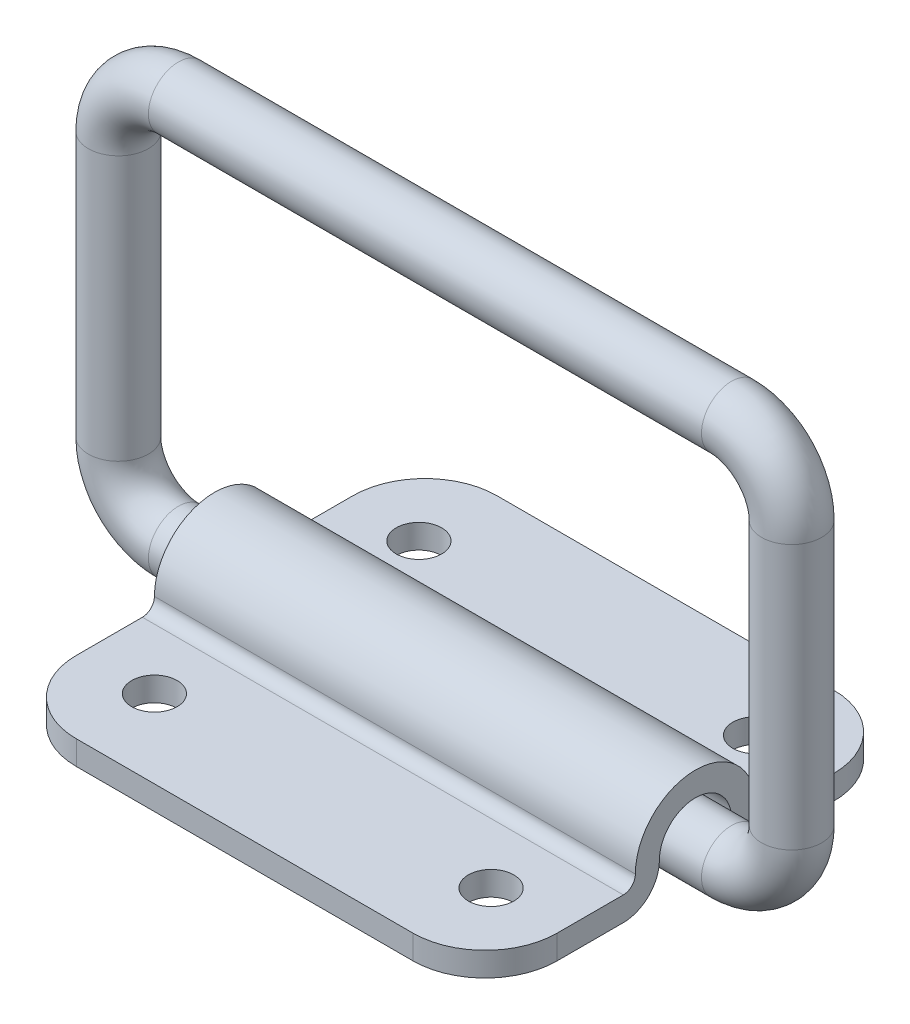
ISO-10303-21;
HEADER;
FILE_DESCRIPTION(('STEP AP214'),'2;1');
FILE_NAME('part.step','',(''),(''),'','','');
FILE_SCHEMA(('AUTOMOTIVE_DESIGN { 1 0 10303 214 1 1 1 1 }'));
ENDSEC;
DATA;
#1=APPLICATION_CONTEXT('core data for automotive mechanical design processes');
#2=APPLICATION_PROTOCOL_DEFINITION('international standard','automotive_design',2000,#1);
#3=PRODUCT_CONTEXT('',#1,'mechanical');
#4=PRODUCT('Part','Part','',(#3));
#5=PRODUCT_RELATED_PRODUCT_CATEGORY('part','',(#4));
#6=PRODUCT_DEFINITION_FORMATION('','',#4);
#7=PRODUCT_DEFINITION_CONTEXT('part definition',#1,'design');
#8=PRODUCT_DEFINITION('design','',#6,#7);
#9=PRODUCT_DEFINITION_SHAPE('','',#8);
#10=(LENGTH_UNIT() NAMED_UNIT(*) SI_UNIT(.MILLI.,.METRE.));
#11=(NAMED_UNIT(*) PLANE_ANGLE_UNIT() SI_UNIT($,.RADIAN.));
#12=(NAMED_UNIT(*) SI_UNIT($,.STERADIAN.) SOLID_ANGLE_UNIT());
#13=UNCERTAINTY_MEASURE_WITH_UNIT(LENGTH_MEASURE(1.E-05),#10,'distance_accuracy_value','');
#14=(GEOMETRIC_REPRESENTATION_CONTEXT(3) GLOBAL_UNCERTAINTY_ASSIGNED_CONTEXT((#13)) GLOBAL_UNIT_ASSIGNED_CONTEXT((#10,
#11,#12)) REPRESENTATION_CONTEXT('',''));
#15=CARTESIAN_POINT('',(0.,0.,0.));
#16=DIRECTION('',(0.,0.,1.));
#17=DIRECTION('',(1.,0.,0.));
#18=AXIS2_PLACEMENT_3D('',#15,#16,#17);
#19=CARTESIAN_POINT('',(-31.75,0.,9.525));
#20=DIRECTION('',(1.,0.,0.));
#21=DIRECTION('',(0.,0.,-1.));
#22=AXIS2_PLACEMENT_3D('',#19,#20,#21);
#23=PLANE('',#22);
#24=DIRECTION('',(0.,-1.,0.));
#25=VECTOR('',#24,1.);
#26=CARTESIAN_POINT('',(-31.75,54.7687500000001,-18.25625));
#27=LINE('',#26,#25);
#28=CARTESIAN_POINT('',(-31.75,-4.7625,-18.25625));
#29=VERTEX_POINT('',#28);
#30=CARTESIAN_POINT('',(-31.75,-1.5875,-18.25625));
#31=VERTEX_POINT('',#30);
#32=EDGE_CURVE('E12',#29,#31,#27,.F.);
#33=ORIENTED_EDGE('',*,*,#32,.F.);
#34=DIRECTION('',(0.,0.,-1.));
#35=VECTOR('',#34,1.);
#36=CARTESIAN_POINT('',(-31.75,-4.7625,-27.78125));
#37=LINE('',#36,#35);
#38=CARTESIAN_POINT('',(-31.75,-4.7625,-9.525));
#39=VERTEX_POINT('',#38);
#40=EDGE_CURVE('E171',#39,#29,#37,.T.);
#41=ORIENTED_EDGE('',*,*,#40,.F.);
#42=CARTESIAN_POINT('',(-31.75,0.,-9.525));
#43=DIRECTION('',(1.,0.,0.));
#44=DIRECTION('',(0.,0.,1.));
#45=AXIS2_PLACEMENT_3D('',#42,#43,#44);
#46=CIRCLE('',#45,4.7625);
#47=CARTESIAN_POINT('',(-31.75,0.,-4.7625));
#48=VERTEX_POINT('',#47);
#49=EDGE_CURVE('E277',#48,#39,#46,.T.);
#50=ORIENTED_EDGE('',*,*,#49,.F.);
#51=CARTESIAN_POINT('',(-31.75,0.,0.));
#52=DIRECTION('',(-1.,0.,0.));
#53=DIRECTION('',(0.,0.,1.));
#54=AXIS2_PLACEMENT_3D('',#51,#52,#53);
#55=CIRCLE('',#54,4.7625);
#56=CARTESIAN_POINT('',(-31.75,0.,4.7625));
#57=VERTEX_POINT('',#56);
#58=EDGE_CURVE('E275',#57,#48,#55,.T.);
#59=ORIENTED_EDGE('',*,*,#58,.F.);
#60=CARTESIAN_POINT('',(-31.75,0.,9.525));
#61=DIRECTION('',(1.,0.,0.));
#62=DIRECTION('',(0.,0.,-1.));
#63=AXIS2_PLACEMENT_3D('',#60,#61,#62);
#64=CIRCLE('',#63,4.7625);
#65=CARTESIAN_POINT('',(-31.75,-4.7625,9.525));
#66=VERTEX_POINT('',#65);
#67=EDGE_CURVE('E273',#66,#57,#64,.T.);
#68=ORIENTED_EDGE('',*,*,#67,.F.);
#69=DIRECTION('',(0.,0.,-1.));
#70=VECTOR('',#69,1.);
#71=CARTESIAN_POINT('',(-31.75,-4.7625,27.78125));
#72=LINE('',#71,#70);
#73=CARTESIAN_POINT('',(-31.75,-4.7625,18.25625));
#74=VERTEX_POINT('',#73);
#75=EDGE_CURVE('E247',#74,#66,#72,.T.);
#76=ORIENTED_EDGE('',*,*,#75,.F.);
#77=DIRECTION('',(0.,-1.,0.));
#78=VECTOR('',#77,1.);
#79=CARTESIAN_POINT('',(-31.75,54.7687500000001,18.25625));
#80=LINE('',#79,#78);
#81=CARTESIAN_POINT('',(-31.75,-1.5875,18.25625));
#82=VERTEX_POINT('',#81);
#83=EDGE_CURVE('E193',#74,#82,#80,.F.);
#84=ORIENTED_EDGE('',*,*,#83,.T.);
#85=DIRECTION('',(0.,0.,1.));
#86=VECTOR('',#85,1.);
#87=CARTESIAN_POINT('',(-31.75,-1.5875,27.78125));
#88=LINE('',#87,#86);
#89=CARTESIAN_POINT('',(-31.75,-1.5875,9.525));
#90=VERTEX_POINT('',#89);
#91=EDGE_CURVE('E251',#90,#82,#88,.T.);
#92=ORIENTED_EDGE('',*,*,#91,.F.);
#93=CARTESIAN_POINT('',(-31.75,0.,9.525));
#94=DIRECTION('',(-1.,0.,0.));
#95=DIRECTION('',(0.,0.,-1.));
#96=AXIS2_PLACEMENT_3D('',#93,#94,#95);
#97=CIRCLE('',#96,1.5875);
#98=CARTESIAN_POINT('',(-31.75,0.,7.9375));
#99=VERTEX_POINT('',#98);
#100=EDGE_CURVE('E286',#99,#90,#97,.T.);
#101=ORIENTED_EDGE('',*,*,#100,.F.);
#102=CARTESIAN_POINT('',(-31.75,0.,0.));
#103=DIRECTION('',(1.,0.,0.));
#104=DIRECTION('',(0.,0.,1.));
#105=AXIS2_PLACEMENT_3D('',#102,#103,#104);
#106=CIRCLE('',#105,7.9375);
#107=CARTESIAN_POINT('',(-31.75,0.,-7.9375));
#108=VERTEX_POINT('',#107);
#109=EDGE_CURVE('E284',#108,#99,#106,.T.);
#110=ORIENTED_EDGE('',*,*,#109,.F.);
#111=CARTESIAN_POINT('',(-31.75,0.,-9.525));
#112=DIRECTION('',(-1.,0.,0.));
#113=DIRECTION('',(0.,0.,1.));
#114=AXIS2_PLACEMENT_3D('',#111,#112,#113);
#115=CIRCLE('',#114,1.5875);
#116=CARTESIAN_POINT('',(-31.75,-1.5875,-9.525));
#117=VERTEX_POINT('',#116);
#118=EDGE_CURVE('E282',#117,#108,#115,.T.);
#119=ORIENTED_EDGE('',*,*,#118,.F.);
#120=DIRECTION('',(0.,0.,1.));
#121=VECTOR('',#120,1.);
#122=CARTESIAN_POINT('',(-31.75,-1.5875,-27.78125));
#123=LINE('',#122,#121);
#124=EDGE_CURVE('E280',#31,#117,#123,.T.);
#125=ORIENTED_EDGE('',*,*,#124,.F.);
#126=EDGE_LOOP('',(#33,#41,#50,#59,#68,#76,#84,#92,#101,#110,#119,#125));
#127=FACE_BOUND('',#126,.T.);
#128=ADVANCED_FACE('F44',(#127),#23,.F.);
#129=CARTESIAN_POINT('',(31.75,-4.7625,-27.78125));
#130=DIRECTION('',(0.,0.,1.));
#131=DIRECTION('',(1.,0.,0.));
#132=AXIS2_PLACEMENT_3D('',#129,#130,#131);
#133=PLANE('',#132);
#134=DIRECTION('',(-1.,0.,0.));
#135=VECTOR('',#134,1.);
#136=CARTESIAN_POINT('',(31.75,-4.7625,-27.78125));
#137=LINE('',#136,#135);
#138=CARTESIAN_POINT('',(22.225,-4.7625,-27.78125));
#139=VERTEX_POINT('',#138);
#140=CARTESIAN_POINT('',(-22.225,-4.7625,-27.78125));
#141=VERTEX_POINT('',#140);
#142=EDGE_CURVE('E168',#139,#141,#137,.T.);
#143=ORIENTED_EDGE('',*,*,#142,.T.);
#144=DIRECTION('',(0.,-1.,0.));
#145=VECTOR('',#144,1.);
#146=CARTESIAN_POINT('',(-22.225,54.7687500000001,-27.78125));
#147=LINE('',#146,#145);
#148=CARTESIAN_POINT('',(-22.225,-1.5875,-27.78125));
#149=VERTEX_POINT('',#148);
#150=EDGE_CURVE('E154',#149,#141,#147,.T.);
#151=ORIENTED_EDGE('',*,*,#150,.F.);
#152=DIRECTION('',(-1.,0.,0.));
#153=VECTOR('',#152,1.);
#154=CARTESIAN_POINT('',(31.75,-1.5875,-27.78125));
#155=LINE('',#154,#153);
#156=CARTESIAN_POINT('',(22.225,-1.5875,-27.78125));
#157=VERTEX_POINT('',#156);
#158=EDGE_CURVE('E177',#157,#149,#155,.T.);
#159=ORIENTED_EDGE('',*,*,#158,.F.);
#160=DIRECTION('',(0.,-1.,0.));
#161=VECTOR('',#160,1.);
#162=CARTESIAN_POINT('',(22.225,54.7687500000001,-27.78125));
#163=LINE('',#162,#161);
#164=EDGE_CURVE('E175',#157,#139,#163,.T.);
#165=ORIENTED_EDGE('',*,*,#164,.T.);
#166=EDGE_LOOP('',(#143,#151,#159,#165));
#167=FACE_BOUND('',#166,.T.);
#168=ADVANCED_FACE('F174',(#167),#133,.F.);
#169=CARTESIAN_POINT('',(31.75,0.,9.525));
#170=DIRECTION('',(1.,0.,0.));
#171=DIRECTION('',(0.,0.,-1.));
#172=AXIS2_PLACEMENT_3D('',#169,#170,#171);
#173=PLANE('',#172);
#174=DIRECTION('',(0.,0.,-1.));
#175=VECTOR('',#174,1.);
#176=CARTESIAN_POINT('',(31.75,-4.7625,-27.78125));
#177=LINE('',#176,#175);
#178=CARTESIAN_POINT('',(31.75,-4.7625,-9.525));
#179=VERTEX_POINT('',#178);
#180=CARTESIAN_POINT('',(31.75,-4.7625,-18.25625));
#181=VERTEX_POINT('',#180);
#182=EDGE_CURVE('E257',#179,#181,#177,.T.);
#183=ORIENTED_EDGE('',*,*,#182,.T.);
#184=DIRECTION('',(0.,-1.,0.));
#185=VECTOR('',#184,1.);
#186=CARTESIAN_POINT('',(31.75,54.7687500000001,-18.25625));
#187=LINE('',#186,#185);
#188=CARTESIAN_POINT('',(31.75,-1.5875,-18.25625));
#189=VERTEX_POINT('',#188);
#190=EDGE_CURVE('E52',#181,#189,#187,.F.);
#191=ORIENTED_EDGE('',*,*,#190,.T.);
#192=DIRECTION('',(0.,0.,1.));
#193=VECTOR('',#192,1.);
#194=CARTESIAN_POINT('',(31.75,-1.5875,-27.78125));
#195=LINE('',#194,#193);
#196=CARTESIAN_POINT('',(31.75,-1.5875,-9.525));
#197=VERTEX_POINT('',#196);
#198=EDGE_CURVE('E260',#189,#197,#195,.T.);
#199=ORIENTED_EDGE('',*,*,#198,.T.);
#200=CARTESIAN_POINT('',(31.75,0.,-9.525));
#201=DIRECTION('',(-1.,0.,0.));
#202=DIRECTION('',(0.,0.,1.));
#203=AXIS2_PLACEMENT_3D('',#200,#201,#202);
#204=CIRCLE('',#203,1.5875);
#205=CARTESIAN_POINT('',(31.75,0.,-7.9375));
#206=VERTEX_POINT('',#205);
#207=EDGE_CURVE('E262',#197,#206,#204,.T.);
#208=ORIENTED_EDGE('',*,*,#207,.T.);
#209=CARTESIAN_POINT('',(31.75,0.,0.));
#210=DIRECTION('',(1.,0.,0.));
#211=DIRECTION('',(0.,0.,1.));
#212=AXIS2_PLACEMENT_3D('',#209,#210,#211);
#213=CIRCLE('',#212,7.9375);
#214=CARTESIAN_POINT('',(31.75,0.,7.9375));
#215=VERTEX_POINT('',#214);
#216=EDGE_CURVE('E264',#206,#215,#213,.T.);
#217=ORIENTED_EDGE('',*,*,#216,.T.);
#218=CARTESIAN_POINT('',(31.75,0.,9.525));
#219=DIRECTION('',(-1.,0.,0.));
#220=DIRECTION('',(0.,0.,-1.));
#221=AXIS2_PLACEMENT_3D('',#218,#219,#220);
#222=CIRCLE('',#221,1.5875);
#223=CARTESIAN_POINT('',(31.75,-1.5875,9.525));
#224=VERTEX_POINT('',#223);
#225=EDGE_CURVE('E266',#215,#224,#222,.T.);
#226=ORIENTED_EDGE('',*,*,#225,.T.);
#227=DIRECTION('',(0.,0.,1.));
#228=VECTOR('',#227,1.);
#229=CARTESIAN_POINT('',(31.75,-1.5875,27.78125));
#230=LINE('',#229,#228);
#231=CARTESIAN_POINT('',(31.75,-1.5875,18.25625));
#232=VERTEX_POINT('',#231);
#233=EDGE_CURVE('E268',#224,#232,#230,.T.);
#234=ORIENTED_EDGE('',*,*,#233,.T.);
#235=DIRECTION('',(0.,-1.,0.));
#236=VECTOR('',#235,1.);
#237=CARTESIAN_POINT('',(31.75,54.7687500000001,18.25625));
#238=LINE('',#237,#236);
#239=CARTESIAN_POINT('',(31.75,-4.7625,18.25625));
#240=VERTEX_POINT('',#239);
#241=EDGE_CURVE('E196',#240,#232,#238,.F.);
#242=ORIENTED_EDGE('',*,*,#241,.F.);
#243=DIRECTION('',(0.,0.,-1.));
#244=VECTOR('',#243,1.);
#245=CARTESIAN_POINT('',(31.75,-4.7625,27.78125));
#246=LINE('',#245,#244);
#247=CARTESIAN_POINT('',(31.75,-4.7625,9.525));
#248=VERTEX_POINT('',#247);
#249=EDGE_CURVE('E248',#240,#248,#246,.T.);
#250=ORIENTED_EDGE('',*,*,#249,.T.);
#251=CARTESIAN_POINT('',(31.75,0.,9.525));
#252=DIRECTION('',(1.,0.,0.));
#253=DIRECTION('',(0.,0.,-1.));
#254=AXIS2_PLACEMENT_3D('',#251,#252,#253);
#255=CIRCLE('',#254,4.7625);
#256=CARTESIAN_POINT('',(31.75,0.,4.7625));
#257=VERTEX_POINT('',#256);
#258=EDGE_CURVE('E250',#248,#257,#255,.T.);
#259=ORIENTED_EDGE('',*,*,#258,.T.);
#260=CARTESIAN_POINT('',(31.75,0.,0.));
#261=DIRECTION('',(-1.,0.,0.));
#262=DIRECTION('',(0.,0.,1.));
#263=AXIS2_PLACEMENT_3D('',#260,#261,#262);
#264=CIRCLE('',#263,4.7625);
#265=CARTESIAN_POINT('',(31.75,0.,-4.7625));
#266=VERTEX_POINT('',#265);
#267=EDGE_CURVE('E253',#257,#266,#264,.T.);
#268=ORIENTED_EDGE('',*,*,#267,.T.);
#269=CARTESIAN_POINT('',(31.75,0.,-9.525));
#270=DIRECTION('',(1.,0.,0.));
#271=DIRECTION('',(0.,0.,1.));
#272=AXIS2_PLACEMENT_3D('',#269,#270,#271);
#273=CIRCLE('',#272,4.7625);
#274=EDGE_CURVE('E255',#266,#179,#273,.T.);
#275=ORIENTED_EDGE('',*,*,#274,.T.);
#276=EDGE_LOOP('',(#183,#191,#199,#208,#217,#226,#234,#242,#250,#259,#268,#275));
#277=FACE_BOUND('',#276,.T.);
#278=ADVANCED_FACE('F325',(#277),#173,.T.);
#279=CARTESIAN_POINT('',(31.75,-4.7625,27.78125));
#280=DIRECTION('',(0.,0.,-1.));
#281=DIRECTION('',(-1.,0.,0.));
#282=AXIS2_PLACEMENT_3D('',#279,#280,#281);
#283=PLANE('',#282);
#284=DIRECTION('',(-1.,0.,0.));
#285=VECTOR('',#284,1.);
#286=CARTESIAN_POINT('',(31.75,-4.7625,27.78125));
#287=LINE('',#286,#285);
#288=CARTESIAN_POINT('',(22.225,-4.7625,27.78125));
#289=VERTEX_POINT('',#288);
#290=CARTESIAN_POINT('',(-22.225,-4.7625,27.78125));
#291=VERTEX_POINT('',#290);
#292=EDGE_CURVE('E271',#289,#291,#287,.T.);
#293=ORIENTED_EDGE('',*,*,#292,.F.);
#294=DIRECTION('',(0.,-1.,0.));
#295=VECTOR('',#294,1.);
#296=CARTESIAN_POINT('',(22.225,54.7687500000001,27.78125));
#297=LINE('',#296,#295);
#298=CARTESIAN_POINT('',(22.225,-1.5875,27.78125));
#299=VERTEX_POINT('',#298);
#300=EDGE_CURVE('E232',#299,#289,#297,.T.);
#301=ORIENTED_EDGE('',*,*,#300,.F.);
#302=DIRECTION('',(-1.,0.,0.));
#303=VECTOR('',#302,1.);
#304=CARTESIAN_POINT('',(31.75,-1.5875,27.78125));
#305=LINE('',#304,#303);
#306=CARTESIAN_POINT('',(-22.225,-1.5875,27.78125));
#307=VERTEX_POINT('',#306);
#308=EDGE_CURVE('E291',#299,#307,#305,.T.);
#309=ORIENTED_EDGE('',*,*,#308,.T.);
#310=DIRECTION('',(0.,-1.,0.));
#311=VECTOR('',#310,1.);
#312=CARTESIAN_POINT('',(-22.225,54.7687500000001,27.78125));
#313=LINE('',#312,#311);
#314=EDGE_CURVE('E241',#307,#291,#313,.T.);
#315=ORIENTED_EDGE('',*,*,#314,.T.);
#316=EDGE_LOOP('',(#293,#301,#309,#315));
#317=FACE_BOUND('',#316,.T.);
#318=ADVANCED_FACE('F348',(#317),#283,.F.);
#319=CARTESIAN_POINT('',(31.75,-4.7625,27.78125));
#320=DIRECTION('',(0.,1.,0.));
#321=DIRECTION('',(0.,0.,1.));
#322=AXIS2_PLACEMENT_3D('',#319,#320,#321);
#323=PLANE('',#322);
#324=CARTESIAN_POINT('',(-22.225,-4.7625,17.4625));
#325=DIRECTION('',(0.,-1.,0.));
#326=DIRECTION('',(0.,0.,-1.));
#327=AXIS2_PLACEMENT_3D('',#324,#325,#326);
#328=CIRCLE('',#327,3.);
#329=CARTESIAN_POINT('',(-22.225,-4.7625,14.4625));
#330=VERTEX_POINT('',#329);
#331=EDGE_CURVE('E207',#330,#330,#328,.T.);
#332=ORIENTED_EDGE('',*,*,#331,.F.);
#333=EDGE_LOOP('',(#332));
#334=FACE_BOUND('',#333,.T.);
#335=CARTESIAN_POINT('',(22.225,-4.7625,17.4625));
#336=DIRECTION('',(0.,-1.,0.));
#337=DIRECTION('',(0.,0.,1.));
#338=AXIS2_PLACEMENT_3D('',#335,#336,#337);
#339=CIRCLE('',#338,3.);
#340=CARTESIAN_POINT('',(22.225,-4.7625,20.4625));
#341=VERTEX_POINT('',#340);
#342=EDGE_CURVE('E201',#341,#341,#339,.T.);
#343=ORIENTED_EDGE('',*,*,#342,.F.);
#344=EDGE_LOOP('',(#343));
#345=FACE_BOUND('',#344,.T.);
#346=ORIENTED_EDGE('',*,*,#249,.F.);
#347=CARTESIAN_POINT('',(22.225,-4.7625,18.25625));
#348=DIRECTION('',(0.,1.,0.));
#349=DIRECTION('',(0.,0.,1.));
#350=AXIS2_PLACEMENT_3D('',#347,#348,#349);
#351=CIRCLE('',#350,9.525);
#352=EDGE_CURVE('E206',#289,#240,#351,.T.);
#353=ORIENTED_EDGE('',*,*,#352,.F.);
#354=ORIENTED_EDGE('',*,*,#292,.T.);
#355=CARTESIAN_POINT('',(-22.225,-4.7625,18.25625));
#356=DIRECTION('',(0.,1.,0.));
#357=DIRECTION('',(0.,0.,-1.));
#358=AXIS2_PLACEMENT_3D('',#355,#356,#357);
#359=CIRCLE('',#358,9.525);
#360=EDGE_CURVE('E200',#74,#291,#359,.T.);
#361=ORIENTED_EDGE('',*,*,#360,.F.);
#362=ORIENTED_EDGE('',*,*,#75,.T.);
#363=DIRECTION('',(-1.,0.,0.));
#364=VECTOR('',#363,1.);
#365=CARTESIAN_POINT('',(31.75,-4.7625,9.525));
#366=LINE('',#365,#364);
#367=EDGE_CURVE('E190',#248,#66,#366,.T.);
#368=ORIENTED_EDGE('',*,*,#367,.F.);
#369=EDGE_LOOP('',(#346,#353,#354,#361,#362,#368));
#370=FACE_BOUND('',#369,.T.);
#371=ADVANCED_FACE('F46',(#334,#345,#370),#323,.F.);
#372=CARTESIAN_POINT('',(31.75,0.,9.525));
#373=DIRECTION('',(-1.,0.,0.));
#374=DIRECTION('',(0.,0.,1.));
#375=AXIS2_PLACEMENT_3D('',#372,#373,#374);
#376=CYLINDRICAL_SURFACE('',#375,4.7625);
#377=ORIENTED_EDGE('',*,*,#67,.T.);
#378=DIRECTION('',(-1.,0.,0.));
#379=VECTOR('',#378,1.);
#380=CARTESIAN_POINT('',(31.75,0.,4.7625));
#381=LINE('',#380,#379);
#382=EDGE_CURVE('E187',#257,#57,#381,.T.);
#383=ORIENTED_EDGE('',*,*,#382,.F.);
#384=ORIENTED_EDGE('',*,*,#258,.F.);
#385=ORIENTED_EDGE('',*,*,#367,.T.);
#386=EDGE_LOOP('',(#377,#383,#384,#385));
#387=FACE_BOUND('',#386,.T.);
#388=ADVANCED_FACE('F503',(#387),#376,.T.);
#389=CARTESIAN_POINT('',(31.75,0.,0.));
#390=DIRECTION('',(-1.,0.,0.));
#391=DIRECTION('',(0.,0.,1.));
#392=AXIS2_PLACEMENT_3D('',#389,#390,#391);
#393=CYLINDRICAL_SURFACE('',#392,4.7625);
#394=ORIENTED_EDGE('',*,*,#58,.T.);
#395=DIRECTION('',(-1.,0.,0.));
#396=VECTOR('',#395,1.);
#397=CARTESIAN_POINT('',(31.75,0.,-4.7625));
#398=LINE('',#397,#396);
#399=EDGE_CURVE('E179',#266,#48,#398,.T.);
#400=ORIENTED_EDGE('',*,*,#399,.F.);
#401=ORIENTED_EDGE('',*,*,#267,.F.);
#402=ORIENTED_EDGE('',*,*,#382,.T.);
#403=EDGE_LOOP('',(#394,#400,#401,#402));
#404=FACE_BOUND('',#403,.T.);
#405=ADVANCED_FACE('F494',(#404),#393,.F.);
#406=CARTESIAN_POINT('',(31.75,0.,-9.525));
#407=DIRECTION('',(-1.,0.,0.));
#408=DIRECTION('',(0.,0.,1.));
#409=AXIS2_PLACEMENT_3D('',#406,#407,#408);
#410=CYLINDRICAL_SURFACE('',#409,4.7625);
#411=ORIENTED_EDGE('',*,*,#49,.T.);
#412=DIRECTION('',(-1.,0.,0.));
#413=VECTOR('',#412,1.);
#414=CARTESIAN_POINT('',(31.75,-4.7625,-9.525));
#415=LINE('',#414,#413);
#416=EDGE_CURVE('E176',#179,#39,#415,.T.);
#417=ORIENTED_EDGE('',*,*,#416,.F.);
#418=ORIENTED_EDGE('',*,*,#274,.F.);
#419=ORIENTED_EDGE('',*,*,#399,.T.);
#420=EDGE_LOOP('',(#411,#417,#418,#419));
#421=FACE_BOUND('',#420,.T.);
#422=ADVANCED_FACE('F335',(#421),#410,.T.);
#423=CARTESIAN_POINT('',(31.75,-4.7625,-27.78125));
#424=DIRECTION('',(0.,1.,0.));
#425=DIRECTION('',(0.,0.,1.));
#426=AXIS2_PLACEMENT_3D('',#423,#424,#425);
#427=PLANE('',#426);
#428=CARTESIAN_POINT('',(-22.225,-4.7625,-17.4625));
#429=DIRECTION('',(0.,-1.,0.));
#430=DIRECTION('',(0.,0.,1.));
#431=AXIS2_PLACEMENT_3D('',#428,#429,#430);
#432=CIRCLE('',#431,3.);
#433=CARTESIAN_POINT('',(-22.225,-4.7625,-14.4625));
#434=VERTEX_POINT('',#433);
#435=EDGE_CURVE('E215',#434,#434,#432,.T.);
#436=ORIENTED_EDGE('',*,*,#435,.F.);
#437=EDGE_LOOP('',(#436));
#438=FACE_BOUND('',#437,.T.);
#439=CARTESIAN_POINT('',(22.225,-4.7625,-17.4625));
#440=DIRECTION('',(0.,-1.,0.));
#441=DIRECTION('',(0.,0.,-1.));
#442=AXIS2_PLACEMENT_3D('',#439,#440,#441);
#443=CIRCLE('',#442,3.);
#444=CARTESIAN_POINT('',(22.225,-4.7625,-20.4625));
#445=VERTEX_POINT('',#444);
#446=EDGE_CURVE('E212',#445,#445,#443,.T.);
#447=ORIENTED_EDGE('',*,*,#446,.F.);
#448=EDGE_LOOP('',(#447));
#449=FACE_BOUND('',#448,.T.);
#450=ORIENTED_EDGE('',*,*,#40,.T.);
#451=CARTESIAN_POINT('',(-22.225,-4.7625,-18.25625));
#452=DIRECTION('',(0.,1.,0.));
#453=DIRECTION('',(0.,0.,1.));
#454=AXIS2_PLACEMENT_3D('',#451,#452,#453);
#455=CIRCLE('',#454,9.525);
#456=EDGE_CURVE('E58',#141,#29,#455,.T.);
#457=ORIENTED_EDGE('',*,*,#456,.F.);
#458=ORIENTED_EDGE('',*,*,#142,.F.);
#459=CARTESIAN_POINT('',(22.225,-4.7625,-18.25625));
#460=DIRECTION('',(0.,1.,0.));
#461=DIRECTION('',(0.,0.,-1.));
#462=AXIS2_PLACEMENT_3D('',#459,#460,#461);
#463=CIRCLE('',#462,9.525);
#464=EDGE_CURVE('E211',#181,#139,#463,.T.);
#465=ORIENTED_EDGE('',*,*,#464,.F.);
#466=ORIENTED_EDGE('',*,*,#182,.F.);
#467=ORIENTED_EDGE('',*,*,#416,.T.);
#468=EDGE_LOOP('',(#450,#457,#458,#465,#466,#467));
#469=FACE_BOUND('',#468,.T.);
#470=ADVANCED_FACE('F166',(#438,#449,#469),#427,.F.);
#471=CARTESIAN_POINT('',(31.75,-1.5875,-27.78125));
#472=DIRECTION('',(0.,-1.,0.));
#473=DIRECTION('',(0.,0.,-1.));
#474=AXIS2_PLACEMENT_3D('',#471,#472,#473);
#475=PLANE('',#474);
#476=CARTESIAN_POINT('',(-22.225,-1.5875,-17.4625));
#477=DIRECTION('',(0.,-1.,0.));
#478=DIRECTION('',(0.,0.,-1.));
#479=AXIS2_PLACEMENT_3D('',#476,#477,#478);
#480=CIRCLE('',#479,3.);
#481=CARTESIAN_POINT('',(-22.225,-1.5875,-20.4625));
#482=VERTEX_POINT('',#481);
#483=EDGE_CURVE('E213',#482,#482,#480,.T.);
#484=ORIENTED_EDGE('',*,*,#483,.T.);
#485=EDGE_LOOP('',(#484));
#486=FACE_BOUND('',#485,.T.);
#487=CARTESIAN_POINT('',(22.225,-1.5875,-17.4625));
#488=DIRECTION('',(0.,-1.,0.));
#489=DIRECTION('',(0.,0.,-1.));
#490=AXIS2_PLACEMENT_3D('',#487,#488,#489);
#491=CIRCLE('',#490,3.);
#492=CARTESIAN_POINT('',(22.225,-1.5875,-20.4625));
#493=VERTEX_POINT('',#492);
#494=EDGE_CURVE('E209',#493,#493,#491,.T.);
#495=ORIENTED_EDGE('',*,*,#494,.T.);
#496=EDGE_LOOP('',(#495));
#497=FACE_BOUND('',#496,.T.);
#498=ORIENTED_EDGE('',*,*,#158,.T.);
#499=CARTESIAN_POINT('',(-22.225,-1.5875,-18.25625));
#500=DIRECTION('',(0.,-1.,0.));
#501=DIRECTION('',(0.,0.,-1.));
#502=AXIS2_PLACEMENT_3D('',#499,#500,#501);
#503=CIRCLE('',#502,9.525);
#504=EDGE_CURVE('E157',#149,#31,#503,.F.);
#505=ORIENTED_EDGE('',*,*,#504,.T.);
#506=ORIENTED_EDGE('',*,*,#124,.T.);
#507=DIRECTION('',(-1.,0.,0.));
#508=VECTOR('',#507,1.);
#509=CARTESIAN_POINT('',(31.75,-1.5875,-9.525));
#510=LINE('',#509,#508);
#511=EDGE_CURVE('E181',#197,#117,#510,.T.);
#512=ORIENTED_EDGE('',*,*,#511,.F.);
#513=ORIENTED_EDGE('',*,*,#198,.F.);
#514=CARTESIAN_POINT('',(22.225,-1.5875,-18.25625));
#515=DIRECTION('',(0.,-1.,0.));
#516=DIRECTION('',(0.,0.,-1.));
#517=AXIS2_PLACEMENT_3D('',#514,#515,#516);
#518=CIRCLE('',#517,9.525);
#519=EDGE_CURVE('E66',#189,#157,#518,.F.);
#520=ORIENTED_EDGE('',*,*,#519,.T.);
#521=EDGE_LOOP('',(#498,#505,#506,#512,#513,#520));
#522=FACE_BOUND('',#521,.T.);
#523=ADVANCED_FACE('F327',(#486,#497,#522),#475,.F.);
#524=CARTESIAN_POINT('',(31.75,0.,-9.525));
#525=DIRECTION('',(-1.,0.,0.));
#526=DIRECTION('',(0.,0.,1.));
#527=AXIS2_PLACEMENT_3D('',#524,#525,#526);
#528=CYLINDRICAL_SURFACE('',#527,1.5875);
#529=ORIENTED_EDGE('',*,*,#118,.T.);
#530=DIRECTION('',(-1.,0.,0.));
#531=VECTOR('',#530,1.);
#532=CARTESIAN_POINT('',(31.75,0.,-7.9375));
#533=LINE('',#532,#531);
#534=EDGE_CURVE('E299',#206,#108,#533,.T.);
#535=ORIENTED_EDGE('',*,*,#534,.F.);
#536=ORIENTED_EDGE('',*,*,#207,.F.);
#537=ORIENTED_EDGE('',*,*,#511,.T.);
#538=EDGE_LOOP('',(#529,#535,#536,#537));
#539=FACE_BOUND('',#538,.T.);
#540=ADVANCED_FACE('F306',(#539),#528,.F.);
#541=CARTESIAN_POINT('',(31.75,0.,0.));
#542=DIRECTION('',(-1.,0.,0.));
#543=DIRECTION('',(0.,0.,1.));
#544=AXIS2_PLACEMENT_3D('',#541,#542,#543);
#545=CYLINDRICAL_SURFACE('',#544,7.9375);
#546=ORIENTED_EDGE('',*,*,#109,.T.);
#547=DIRECTION('',(-1.,0.,0.));
#548=VECTOR('',#547,1.);
#549=CARTESIAN_POINT('',(31.75,0.,7.9375));
#550=LINE('',#549,#548);
#551=EDGE_CURVE('E296',#215,#99,#550,.T.);
#552=ORIENTED_EDGE('',*,*,#551,.F.);
#553=ORIENTED_EDGE('',*,*,#216,.F.);
#554=ORIENTED_EDGE('',*,*,#534,.T.);
#555=EDGE_LOOP('',(#546,#552,#553,#554));
#556=FACE_BOUND('',#555,.T.);
#557=ADVANCED_FACE('F317',(#556),#545,.T.);
#558=CARTESIAN_POINT('',(31.75,0.,9.525));
#559=DIRECTION('',(-1.,0.,0.));
#560=DIRECTION('',(0.,0.,1.));
#561=AXIS2_PLACEMENT_3D('',#558,#559,#560);
#562=CYLINDRICAL_SURFACE('',#561,1.5875);
#563=ORIENTED_EDGE('',*,*,#100,.T.);
#564=DIRECTION('',(-1.,0.,0.));
#565=VECTOR('',#564,1.);
#566=CARTESIAN_POINT('',(31.75,-1.5875,9.525));
#567=LINE('',#566,#565);
#568=EDGE_CURVE('E293',#224,#90,#567,.T.);
#569=ORIENTED_EDGE('',*,*,#568,.F.);
#570=ORIENTED_EDGE('',*,*,#225,.F.);
#571=ORIENTED_EDGE('',*,*,#551,.T.);
#572=EDGE_LOOP('',(#563,#569,#570,#571));
#573=FACE_BOUND('',#572,.T.);
#574=ADVANCED_FACE('F321',(#573),#562,.F.);
#575=CARTESIAN_POINT('',(31.75,-1.5875,27.78125));
#576=DIRECTION('',(0.,-1.,0.));
#577=DIRECTION('',(0.,0.,-1.));
#578=AXIS2_PLACEMENT_3D('',#575,#576,#577);
#579=PLANE('',#578);
#580=CARTESIAN_POINT('',(-22.225,-1.5875,17.4625));
#581=DIRECTION('',(0.,-1.,0.));
#582=DIRECTION('',(0.,0.,-1.));
#583=AXIS2_PLACEMENT_3D('',#580,#581,#582);
#584=CIRCLE('',#583,3.);
#585=CARTESIAN_POINT('',(-22.225,-1.5875,14.4625));
#586=VERTEX_POINT('',#585);
#587=EDGE_CURVE('E203',#586,#586,#584,.T.);
#588=ORIENTED_EDGE('',*,*,#587,.T.);
#589=EDGE_LOOP('',(#588));
#590=FACE_BOUND('',#589,.T.);
#591=CARTESIAN_POINT('',(22.225,-1.5875,17.4625));
#592=DIRECTION('',(0.,-1.,0.));
#593=DIRECTION('',(0.,0.,-1.));
#594=AXIS2_PLACEMENT_3D('',#591,#592,#593);
#595=CIRCLE('',#594,3.);
#596=CARTESIAN_POINT('',(22.225,-1.5875,14.4625));
#597=VERTEX_POINT('',#596);
#598=EDGE_CURVE('E197',#597,#597,#595,.T.);
#599=ORIENTED_EDGE('',*,*,#598,.T.);
#600=EDGE_LOOP('',(#599));
#601=FACE_BOUND('',#600,.T.);
#602=ORIENTED_EDGE('',*,*,#308,.F.);
#603=CARTESIAN_POINT('',(22.225,-1.5875,18.25625));
#604=DIRECTION('',(0.,-1.,0.));
#605=DIRECTION('',(0.,0.,-1.));
#606=AXIS2_PLACEMENT_3D('',#603,#604,#605);
#607=CIRCLE('',#606,9.525);
#608=EDGE_CURVE('E234',#299,#232,#607,.F.);
#609=ORIENTED_EDGE('',*,*,#608,.T.);
#610=ORIENTED_EDGE('',*,*,#233,.F.);
#611=ORIENTED_EDGE('',*,*,#568,.T.);
#612=ORIENTED_EDGE('',*,*,#91,.T.);
#613=CARTESIAN_POINT('',(-22.225,-1.5875,18.25625));
#614=DIRECTION('',(0.,-1.,0.));
#615=DIRECTION('',(0.,0.,-1.));
#616=AXIS2_PLACEMENT_3D('',#613,#614,#615);
#617=CIRCLE('',#616,9.525);
#618=EDGE_CURVE('E244',#82,#307,#617,.F.);
#619=ORIENTED_EDGE('',*,*,#618,.T.);
#620=EDGE_LOOP('',(#602,#609,#610,#611,#612,#619));
#621=FACE_BOUND('',#620,.T.);
#622=ADVANCED_FACE('F352',(#590,#601,#621),#579,.F.);
#623=CARTESIAN_POINT('',(-22.225,54.7687500000001,18.25625));
#624=DIRECTION('',(0.,-1.,0.));
#625=DIRECTION('',(0.,0.,-1.));
#626=AXIS2_PLACEMENT_3D('',#623,#624,#625);
#627=CYLINDRICAL_SURFACE('',#626,9.525);
#628=ORIENTED_EDGE('',*,*,#83,.F.);
#629=ORIENTED_EDGE('',*,*,#360,.T.);
#630=ORIENTED_EDGE('',*,*,#314,.F.);
#631=ORIENTED_EDGE('',*,*,#618,.F.);
#632=EDGE_LOOP('',(#628,#629,#630,#631));
#633=FACE_BOUND('',#632,.T.);
#634=ADVANCED_FACE('F355',(#633),#627,.T.);
#635=CARTESIAN_POINT('',(22.225,54.7687500000001,17.4625));
#636=DIRECTION('',(0.,-1.,0.));
#637=DIRECTION('',(0.,0.,-1.));
#638=AXIS2_PLACEMENT_3D('',#635,#636,#637);
#639=CYLINDRICAL_SURFACE('',#638,3.);
#640=ORIENTED_EDGE('',*,*,#342,.T.);
#641=EDGE_LOOP('',(#640));
#642=FACE_BOUND('',#641,.T.);
#643=ORIENTED_EDGE('',*,*,#598,.F.);
#644=EDGE_LOOP('',(#643));
#645=FACE_BOUND('',#644,.T.);
#646=ADVANCED_FACE('F378',(#642,#645),#639,.F.);
#647=CARTESIAN_POINT('',(22.225,54.7687500000001,18.25625));
#648=DIRECTION('',(0.,-1.,0.));
#649=DIRECTION('',(0.,0.,-1.));
#650=AXIS2_PLACEMENT_3D('',#647,#648,#649);
#651=CYLINDRICAL_SURFACE('',#650,9.525);
#652=ORIENTED_EDGE('',*,*,#300,.T.);
#653=ORIENTED_EDGE('',*,*,#352,.T.);
#654=ORIENTED_EDGE('',*,*,#241,.T.);
#655=ORIENTED_EDGE('',*,*,#608,.F.);
#656=EDGE_LOOP('',(#652,#653,#654,#655));
#657=FACE_BOUND('',#656,.T.);
#658=ADVANCED_FACE('F385',(#657),#651,.T.);
#659=CARTESIAN_POINT('',(-22.225,54.7687500000001,17.4625));
#660=DIRECTION('',(0.,-1.,0.));
#661=DIRECTION('',(0.,0.,-1.));
#662=AXIS2_PLACEMENT_3D('',#659,#660,#661);
#663=CYLINDRICAL_SURFACE('',#662,3.);
#664=ORIENTED_EDGE('',*,*,#331,.T.);
#665=EDGE_LOOP('',(#664));
#666=FACE_BOUND('',#665,.T.);
#667=ORIENTED_EDGE('',*,*,#587,.F.);
#668=EDGE_LOOP('',(#667));
#669=FACE_BOUND('',#668,.T.);
#670=ADVANCED_FACE('F393',(#666,#669),#663,.F.);
#671=CARTESIAN_POINT('',(22.225,54.7687500000001,-18.25625));
#672=DIRECTION('',(0.,-1.,0.));
#673=DIRECTION('',(0.,0.,-1.));
#674=AXIS2_PLACEMENT_3D('',#671,#672,#673);
#675=CYLINDRICAL_SURFACE('',#674,9.525);
#676=ORIENTED_EDGE('',*,*,#190,.F.);
#677=ORIENTED_EDGE('',*,*,#464,.T.);
#678=ORIENTED_EDGE('',*,*,#164,.F.);
#679=ORIENTED_EDGE('',*,*,#519,.F.);
#680=EDGE_LOOP('',(#676,#677,#678,#679));
#681=FACE_BOUND('',#680,.T.);
#682=ADVANCED_FACE('F401',(#681),#675,.T.);
#683=CARTESIAN_POINT('',(22.225,54.7687500000001,-17.4625));
#684=DIRECTION('',(0.,-1.,0.));
#685=DIRECTION('',(0.,0.,-1.));
#686=AXIS2_PLACEMENT_3D('',#683,#684,#685);
#687=CYLINDRICAL_SURFACE('',#686,3.);
#688=ORIENTED_EDGE('',*,*,#446,.T.);
#689=EDGE_LOOP('',(#688));
#690=FACE_BOUND('',#689,.T.);
#691=ORIENTED_EDGE('',*,*,#494,.F.);
#692=EDGE_LOOP('',(#691));
#693=FACE_BOUND('',#692,.T.);
#694=ADVANCED_FACE('F409',(#690,#693),#687,.F.);
#695=CARTESIAN_POINT('',(-22.225,54.7687500000001,-17.4625));
#696=DIRECTION('',(0.,-1.,0.));
#697=DIRECTION('',(0.,0.,-1.));
#698=AXIS2_PLACEMENT_3D('',#695,#696,#697);
#699=CYLINDRICAL_SURFACE('',#698,3.);
#700=ORIENTED_EDGE('',*,*,#435,.T.);
#701=EDGE_LOOP('',(#700));
#702=FACE_BOUND('',#701,.T.);
#703=ORIENTED_EDGE('',*,*,#483,.F.);
#704=EDGE_LOOP('',(#703));
#705=FACE_BOUND('',#704,.T.);
#706=ADVANCED_FACE('F416',(#702,#705),#699,.F.);
#707=CARTESIAN_POINT('',(-22.225,54.7687500000001,-18.25625));
#708=DIRECTION('',(0.,-1.,0.));
#709=DIRECTION('',(0.,0.,-1.));
#710=AXIS2_PLACEMENT_3D('',#707,#708,#709);
#711=CYLINDRICAL_SURFACE('',#710,9.525);
#712=ORIENTED_EDGE('',*,*,#150,.T.);
#713=ORIENTED_EDGE('',*,*,#456,.T.);
#714=ORIENTED_EDGE('',*,*,#32,.T.);
#715=ORIENTED_EDGE('',*,*,#504,.F.);
#716=EDGE_LOOP('',(#712,#713,#714,#715));
#717=FACE_BOUND('',#716,.T.);
#718=ADVANCED_FACE('F155',(#717),#711,.T.);
#719=CLOSED_SHELL('',(#128,#168,#278,#318,#371,#388,#405,#422,#470,#523,#540,#557,#574,#622,
#634,#646,#658,#670,#682,#694,#706,#718));
#720=MANIFOLD_SOLID_BREP('B2',#719);
#721=CARTESIAN_POINT('',(36.5125,7.9375,0.));
#722=DIRECTION('',(0.,0.,-1.));
#723=DIRECTION('',(-1.,0.,0.));
#724=AXIS2_PLACEMENT_3D('',#721,#722,#723);
#725=TOROIDAL_SURFACE('',#724,7.93749999999998,3.96875);
#726=CARTESIAN_POINT('',(44.45,7.9375,0.));
#727=DIRECTION('',(0.,1.,0.));
#728=DIRECTION('',(0.,0.,-1.));
#729=AXIS2_PLACEMENT_3D('',#726,#727,#728);
#730=CIRCLE('',#729,3.96875);
#731=CARTESIAN_POINT('',(48.41875,7.9375,0.));
#732=VERTEX_POINT('',#731);
#733=EDGE_CURVE('E569',#732,#732,#730,.T.);
#734=CARTESIAN_POINT('',(36.5125,0.,0.));
#735=DIRECTION('',(1.,0.,0.));
#736=DIRECTION('',(0.,0.,-1.));
#737=AXIS2_PLACEMENT_3D('',#734,#735,#736);
#738=CIRCLE('',#737,3.96875);
#739=CARTESIAN_POINT('',(36.5125,-3.96874999999998,0.));
#740=VERTEX_POINT('',#739);
#741=EDGE_CURVE('E43',#740,#740,#738,.T.);
#742=CARTESIAN_POINT('',(36.5125,7.9375,0.));
#743=DIRECTION('',(0.,0.,-1.));
#744=DIRECTION('',(-1.,0.,0.));
#745=AXIS2_PLACEMENT_3D('',#742,#743,#744);
#746=CIRCLE('',#745,11.90625);
#747=EDGE_CURVE('',#732,#740,#746,.T.);
#748=ORIENTED_EDGE('',*,*,#733,.F.);
#749=ORIENTED_EDGE('',*,*,#741,.T.);
#750=ORIENTED_EDGE('',*,*,#747,.T.);
#751=ORIENTED_EDGE('',*,*,#747,.F.);
#752=EDGE_LOOP('',(#748,#750,#749,#751));
#753=FACE_BOUND('',#752,.T.);
#754=ADVANCED_FACE('F563',(#753),#725,.T.);
#755=CARTESIAN_POINT('',(44.45,42.8625000000001,0.));
#756=DIRECTION('',(0.,-1.,0.));
#757=DIRECTION('',(1.,0.,0.));
#758=AXIS2_PLACEMENT_3D('',#755,#756,#757);
#759=CYLINDRICAL_SURFACE('',#758,3.96875);
#760=CARTESIAN_POINT('',(44.45,42.8625000000001,0.));
#761=DIRECTION('',(0.,1.,0.));
#762=DIRECTION('',(0.,0.,-1.));
#763=AXIS2_PLACEMENT_3D('',#760,#761,#762);
#764=CIRCLE('',#763,3.96875);
#765=CARTESIAN_POINT('',(48.41875,42.8625000000001,0.));
#766=VERTEX_POINT('',#765);
#767=EDGE_CURVE('E573',#766,#766,#764,.T.);
#768=ORIENTED_EDGE('',*,*,#767,.F.);
#769=EDGE_LOOP('',(#768));
#770=FACE_BOUND('',#769,.T.);
#771=ORIENTED_EDGE('',*,*,#733,.T.);
#772=EDGE_LOOP('',(#771));
#773=FACE_BOUND('',#772,.T.);
#774=ADVANCED_FACE('F625',(#770,#773),#759,.T.);
#775=CARTESIAN_POINT('',(36.5125,42.8625000000001,0.));
#776=DIRECTION('',(0.,0.,-1.));
#777=DIRECTION('',(-1.,0.,0.));
#778=AXIS2_PLACEMENT_3D('',#775,#776,#777);
#779=TOROIDAL_SURFACE('',#778,7.93749999999998,3.96875);
#780=CARTESIAN_POINT('',(36.5125,50.8000000000001,0.));
#781=DIRECTION('',(-1.,0.,0.));
#782=DIRECTION('',(0.,0.,-1.));
#783=AXIS2_PLACEMENT_3D('',#780,#781,#782);
#784=CIRCLE('',#783,3.96875);
#785=CARTESIAN_POINT('',(36.5125,54.7687500000001,0.));
#786=VERTEX_POINT('',#785);
#787=EDGE_CURVE('E577',#786,#786,#784,.T.);
#788=CARTESIAN_POINT('',(36.5125,42.8625000000001,0.));
#789=DIRECTION('',(0.,0.,-1.));
#790=DIRECTION('',(-1.,0.,0.));
#791=AXIS2_PLACEMENT_3D('',#788,#789,#790);
#792=CIRCLE('',#791,11.90625);
#793=EDGE_CURVE('',#786,#766,#792,.T.);
#794=ORIENTED_EDGE('',*,*,#787,.F.);
#795=ORIENTED_EDGE('',*,*,#767,.T.);
#796=ORIENTED_EDGE('',*,*,#793,.T.);
#797=ORIENTED_EDGE('',*,*,#793,.F.);
#798=EDGE_LOOP('',(#794,#796,#795,#797));
#799=FACE_BOUND('',#798,.T.);
#800=ADVANCED_FACE('F619',(#799),#779,.T.);
#801=CARTESIAN_POINT('',(-36.5125,50.8000000000001,0.));
#802=DIRECTION('',(1.,0.,0.));
#803=DIRECTION('',(0.,1.,0.));
#804=AXIS2_PLACEMENT_3D('',#801,#802,#803);
#805=CYLINDRICAL_SURFACE('',#804,3.96875);
#806=CARTESIAN_POINT('',(-36.5125,50.8000000000001,0.));
#807=DIRECTION('',(-1.,0.,0.));
#808=DIRECTION('',(0.,0.,-1.));
#809=AXIS2_PLACEMENT_3D('',#806,#807,#808);
#810=CIRCLE('',#809,3.96875);
#811=CARTESIAN_POINT('',(-36.5125,54.7687500000001,0.));
#812=VERTEX_POINT('',#811);
#813=EDGE_CURVE('E582',#812,#812,#810,.T.);
#814=ORIENTED_EDGE('',*,*,#813,.F.);
#815=EDGE_LOOP('',(#814));
#816=FACE_BOUND('',#815,.T.);
#817=ORIENTED_EDGE('',*,*,#787,.T.);
#818=EDGE_LOOP('',(#817));
#819=FACE_BOUND('',#818,.T.);
#820=ADVANCED_FACE('F613',(#816,#819),#805,.T.);
#821=CARTESIAN_POINT('',(-36.5125,42.8625000000001,0.));
#822=DIRECTION('',(0.,0.,-1.));
#823=DIRECTION('',(-1.,0.,0.));
#824=AXIS2_PLACEMENT_3D('',#821,#822,#823);
#825=TOROIDAL_SURFACE('',#824,7.93749999999998,3.96875);
#826=CARTESIAN_POINT('',(-44.45,42.8625000000001,0.));
#827=DIRECTION('',(0.,-1.,0.));
#828=DIRECTION('',(0.,0.,-1.));
#829=AXIS2_PLACEMENT_3D('',#826,#827,#828);
#830=CIRCLE('',#829,3.96875);
#831=CARTESIAN_POINT('',(-48.41875,42.8625000000001,0.));
#832=VERTEX_POINT('',#831);
#833=EDGE_CURVE('E585',#832,#832,#830,.T.);
#834=CARTESIAN_POINT('',(-36.5125,42.8625000000001,0.));
#835=DIRECTION('',(0.,0.,-1.));
#836=DIRECTION('',(-1.,0.,0.));
#837=AXIS2_PLACEMENT_3D('',#834,#835,#836);
#838=CIRCLE('',#837,11.90625);
#839=EDGE_CURVE('',#832,#812,#838,.T.);
#840=ORIENTED_EDGE('',*,*,#833,.F.);
#841=ORIENTED_EDGE('',*,*,#813,.T.);
#842=ORIENTED_EDGE('',*,*,#839,.T.);
#843=ORIENTED_EDGE('',*,*,#839,.F.);
#844=EDGE_LOOP('',(#840,#842,#841,#843));
#845=FACE_BOUND('',#844,.T.);
#846=ADVANCED_FACE('F607',(#845),#825,.T.);
#847=CARTESIAN_POINT('',(-44.45,7.9375,0.));
#848=DIRECTION('',(0.,1.,0.));
#849=DIRECTION('',(-1.,0.,0.));
#850=AXIS2_PLACEMENT_3D('',#847,#848,#849);
#851=CYLINDRICAL_SURFACE('',#850,3.96875);
#852=CARTESIAN_POINT('',(-44.45,7.9375,0.));
#853=DIRECTION('',(0.,-1.,0.));
#854=DIRECTION('',(0.,0.,-1.));
#855=AXIS2_PLACEMENT_3D('',#852,#853,#854);
#856=CIRCLE('',#855,3.96875);
#857=CARTESIAN_POINT('',(-48.41875,7.9375,0.));
#858=VERTEX_POINT('',#857);
#859=EDGE_CURVE('E588',#858,#858,#856,.T.);
#860=ORIENTED_EDGE('',*,*,#859,.F.);
#861=EDGE_LOOP('',(#860));
#862=FACE_BOUND('',#861,.T.);
#863=ORIENTED_EDGE('',*,*,#833,.T.);
#864=EDGE_LOOP('',(#863));
#865=FACE_BOUND('',#864,.T.);
#866=ADVANCED_FACE('F601',(#862,#865),#851,.T.);
#867=CARTESIAN_POINT('',(-36.5125,7.9375,0.));
#868=DIRECTION('',(0.,0.,-1.));
#869=DIRECTION('',(-1.,0.,0.));
#870=AXIS2_PLACEMENT_3D('',#867,#868,#869);
#871=TOROIDAL_SURFACE('',#870,7.9375,3.96875);
#872=CARTESIAN_POINT('',(-36.5125,0.,0.));
#873=DIRECTION('',(1.,0.,0.));
#874=DIRECTION('',(0.,0.,-1.));
#875=AXIS2_PLACEMENT_3D('',#872,#873,#874);
#876=CIRCLE('',#875,3.96875);
#877=CARTESIAN_POINT('',(-36.5125,-3.96875,0.));
#878=VERTEX_POINT('',#877);
#879=EDGE_CURVE('E591',#878,#878,#876,.T.);
#880=CARTESIAN_POINT('',(-36.5125,7.9375,0.));
#881=DIRECTION('',(0.,0.,-1.));
#882=DIRECTION('',(-1.,0.,0.));
#883=AXIS2_PLACEMENT_3D('',#880,#881,#882);
#884=CIRCLE('',#883,11.90625);
#885=EDGE_CURVE('',#878,#858,#884,.T.);
#886=ORIENTED_EDGE('',*,*,#879,.F.);
#887=ORIENTED_EDGE('',*,*,#859,.T.);
#888=ORIENTED_EDGE('',*,*,#885,.T.);
#889=ORIENTED_EDGE('',*,*,#885,.F.);
#890=EDGE_LOOP('',(#886,#888,#887,#889));
#891=FACE_BOUND('',#890,.T.);
#892=ADVANCED_FACE('F598',(#891),#871,.T.);
#893=CARTESIAN_POINT('',(-36.5125,0.,0.));
#894=DIRECTION('',(1.,0.,0.));
#895=DIRECTION('',(0.,0.,-1.));
#896=AXIS2_PLACEMENT_3D('',#893,#894,#895);
#897=CYLINDRICAL_SURFACE('',#896,3.96875);
#898=ORIENTED_EDGE('',*,*,#879,.T.);
#899=EDGE_LOOP('',(#898));
#900=FACE_BOUND('',#899,.T.);
#901=ORIENTED_EDGE('',*,*,#741,.F.);
#902=EDGE_LOOP('',(#901));
#903=FACE_BOUND('',#902,.T.);
#904=ADVANCED_FACE('F595',(#900,#903),#897,.T.);
#905=CLOSED_SHELL('',(#754,#774,#800,#820,#846,#866,#892,#904));
#906=MANIFOLD_SOLID_BREP('B6',#905);
#907=ADVANCED_BREP_SHAPE_REPRESENTATION('',(#18,#720,#906),#14);
#908=SHAPE_DEFINITION_REPRESENTATION(#9,#907);
ENDSEC;
END-ISO-10303-21;
